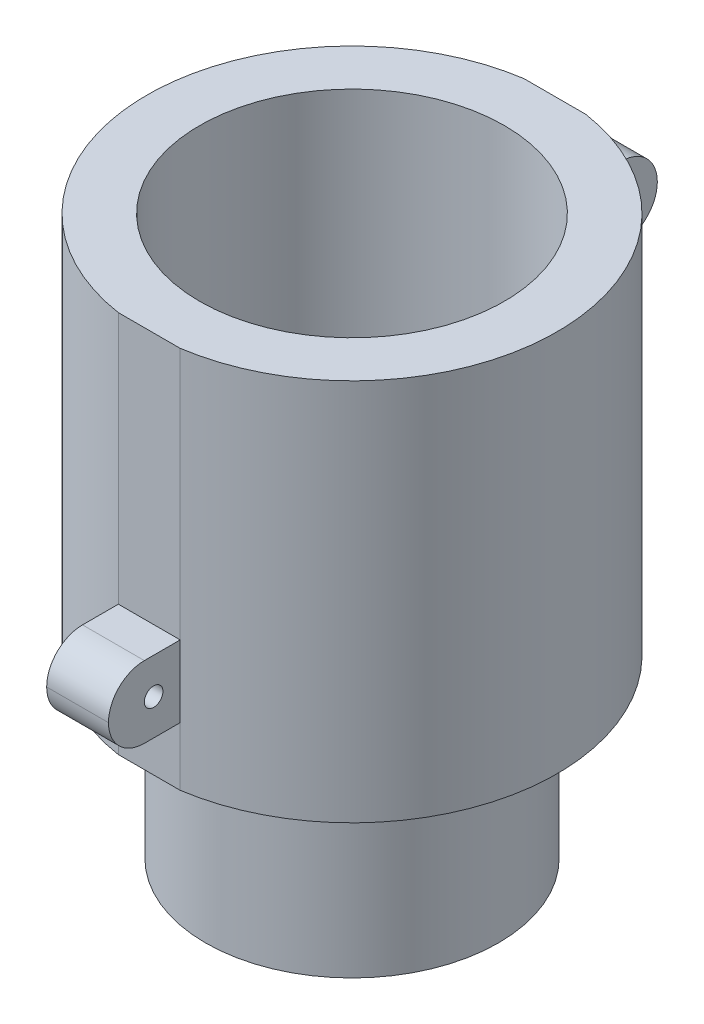
ISO-10303-21;
HEADER;
FILE_DESCRIPTION(('STEP AP214'),'2;1');
FILE_NAME('part.step','',(''),(''),'','','');
FILE_SCHEMA(('AUTOMOTIVE_DESIGN { 1 0 10303 214 1 1 1 1 }'));
ENDSEC;
DATA;
#1=APPLICATION_CONTEXT('core data for automotive mechanical design processes');
#2=APPLICATION_PROTOCOL_DEFINITION('international standard','automotive_design',2000,#1);
#3=PRODUCT_CONTEXT('',#1,'mechanical');
#4=PRODUCT('Part','Part','',(#3));
#5=PRODUCT_RELATED_PRODUCT_CATEGORY('part','',(#4));
#6=PRODUCT_DEFINITION_FORMATION('','',#4);
#7=PRODUCT_DEFINITION_CONTEXT('part definition',#1,'design');
#8=PRODUCT_DEFINITION('design','',#6,#7);
#9=PRODUCT_DEFINITION_SHAPE('','',#8);
#10=(LENGTH_UNIT() NAMED_UNIT(*) SI_UNIT(.MILLI.,.METRE.));
#11=(NAMED_UNIT(*) PLANE_ANGLE_UNIT() SI_UNIT($,.RADIAN.));
#12=(NAMED_UNIT(*) SI_UNIT($,.STERADIAN.) SOLID_ANGLE_UNIT());
#13=UNCERTAINTY_MEASURE_WITH_UNIT(LENGTH_MEASURE(1.E-05),#10,'distance_accuracy_value','');
#14=(GEOMETRIC_REPRESENTATION_CONTEXT(3) GLOBAL_UNCERTAINTY_ASSIGNED_CONTEXT((#13)) GLOBAL_UNIT_ASSIGNED_CONTEXT((#10,
#11,#12)) REPRESENTATION_CONTEXT('',''));
#15=CARTESIAN_POINT('',(0.,0.,0.));
#16=DIRECTION('',(0.,0.,1.));
#17=DIRECTION('',(1.,0.,0.));
#18=AXIS2_PLACEMENT_3D('',#15,#16,#17);
#19=CARTESIAN_POINT('',(-17.5,-2.33500000000001,17.3));
#20=DIRECTION('',(0.,0.,1.));
#21=DIRECTION('',(1.,0.,0.));
#22=AXIS2_PLACEMENT_3D('',#19,#20,#21);
#23=PLANE('',#22);
#24=DIRECTION('',(-1.,0.,0.));
#25=VECTOR('',#24,1.);
#26=CARTESIAN_POINT('',(-2.63818119165462,11.1175,17.3));
#27=LINE('',#26,#25);
#28=CARTESIAN_POINT('',(2.63818119165462,11.1175,17.3));
#29=VERTEX_POINT('',#28);
#30=CARTESIAN_POINT('',(-2.63818119165462,11.1175,17.3));
#31=VERTEX_POINT('',#30);
#32=EDGE_CURVE('E161',#29,#31,#27,.T.);
#33=ORIENTED_EDGE('',*,*,#32,.F.);
#34=DIRECTION('',(0.,-1.,0.));
#35=VECTOR('',#34,1.);
#36=CARTESIAN_POINT('',(2.63818119165462,32.665,17.3));
#37=LINE('',#36,#35);
#38=CARTESIAN_POINT('',(2.63818119165462,32.665,17.3));
#39=VERTEX_POINT('',#38);
#40=EDGE_CURVE('E156',#29,#39,#37,.F.);
#41=ORIENTED_EDGE('',*,*,#40,.T.);
#42=DIRECTION('',(1.,0.,0.));
#43=VECTOR('',#42,1.);
#44=CARTESIAN_POINT('',(-17.5,32.665,17.3));
#45=LINE('',#44,#43);
#46=CARTESIAN_POINT('',(-2.63818119165462,32.665,17.3));
#47=VERTEX_POINT('',#46);
#48=EDGE_CURVE('E208',#47,#39,#45,.T.);
#49=ORIENTED_EDGE('',*,*,#48,.F.);
#50=DIRECTION('',(0.,-1.,0.));
#51=VECTOR('',#50,1.);
#52=CARTESIAN_POINT('',(-2.63818119165462,32.665,17.3));
#53=LINE('',#52,#51);
#54=EDGE_CURVE('E211',#47,#31,#53,.T.);
#55=ORIENTED_EDGE('',*,*,#54,.T.);
#56=EDGE_LOOP('',(#33,#41,#49,#55));
#57=FACE_BOUND('',#56,.T.);
#58=ADVANCED_FACE('F36',(#57),#23,.T.);
#59=CARTESIAN_POINT('',(-17.5,-2.33500000000001,-17.3));
#60=DIRECTION('',(0.,0.,1.));
#61=DIRECTION('',(1.,0.,0.));
#62=AXIS2_PLACEMENT_3D('',#59,#60,#61);
#63=PLANE('',#62);
#64=DIRECTION('',(1.,0.,0.));
#65=VECTOR('',#64,1.);
#66=CARTESIAN_POINT('',(2.63818119165462,27.665,-17.3));
#67=LINE('',#66,#65);
#68=CARTESIAN_POINT('',(-2.63818119165462,27.665,-17.3));
#69=VERTEX_POINT('',#68);
#70=CARTESIAN_POINT('',(2.63818119165462,27.665,-17.3));
#71=VERTEX_POINT('',#70);
#72=EDGE_CURVE('E186',#69,#71,#67,.T.);
#73=ORIENTED_EDGE('',*,*,#72,.F.);
#74=DIRECTION('',(0.,-1.,0.));
#75=VECTOR('',#74,1.);
#76=CARTESIAN_POINT('',(-2.63818119165462,32.665,-17.3));
#77=LINE('',#76,#75);
#78=CARTESIAN_POINT('',(-2.63818119165462,32.665,-17.3));
#79=VERTEX_POINT('',#78);
#80=EDGE_CURVE('E205',#79,#69,#77,.T.);
#81=ORIENTED_EDGE('',*,*,#80,.F.);
#82=DIRECTION('',(1.,0.,0.));
#83=VECTOR('',#82,1.);
#84=CARTESIAN_POINT('',(-17.5,32.665,-17.3));
#85=LINE('',#84,#83);
#86=CARTESIAN_POINT('',(2.63818119165462,32.665,-17.3));
#87=VERTEX_POINT('',#86);
#88=EDGE_CURVE('E197',#79,#87,#85,.T.);
#89=ORIENTED_EDGE('',*,*,#88,.T.);
#90=DIRECTION('',(0.,-1.,0.));
#91=VECTOR('',#90,1.);
#92=CARTESIAN_POINT('',(2.63818119165462,32.665,-17.3));
#93=LINE('',#92,#91);
#94=EDGE_CURVE('E200',#71,#87,#93,.F.);
#95=ORIENTED_EDGE('',*,*,#94,.F.);
#96=EDGE_LOOP('',(#73,#81,#89,#95));
#97=FACE_BOUND('',#96,.T.);
#98=ADVANCED_FACE('F302',(#97),#63,.F.);
#99=DIRECTION('',(-1.,0.,0.));
#100=VECTOR('',#99,1.);
#101=CARTESIAN_POINT('',(2.63818119165462,21.5475,-17.3));
#102=LINE('',#101,#100);
#103=CARTESIAN_POINT('',(2.63818119165462,21.5475,-17.3));
#104=VERTEX_POINT('',#103);
#105=CARTESIAN_POINT('',(-2.63818119165462,21.5475,-17.3));
#106=VERTEX_POINT('',#105);
#107=EDGE_CURVE('E180',#104,#106,#102,.T.);
#108=ORIENTED_EDGE('',*,*,#107,.F.);
#109=CARTESIAN_POINT('',(2.63818119165462,0.,-17.3));
#110=VERTEX_POINT('',#109);
#111=EDGE_CURVE('E201',#110,#104,#93,.F.);
#112=ORIENTED_EDGE('',*,*,#111,.F.);
#113=DIRECTION('',(1.,0.,0.));
#114=VECTOR('',#113,1.);
#115=CARTESIAN_POINT('',(0.,0.,-17.3));
#116=LINE('',#115,#114);
#117=CARTESIAN_POINT('',(-2.63818119165462,0.,-17.3));
#118=VERTEX_POINT('',#117);
#119=EDGE_CURVE('E234',#118,#110,#116,.T.);
#120=ORIENTED_EDGE('',*,*,#119,.F.);
#121=EDGE_CURVE('E204',#106,#118,#77,.T.);
#122=ORIENTED_EDGE('',*,*,#121,.F.);
#123=EDGE_LOOP('',(#108,#112,#120,#122));
#124=FACE_BOUND('',#123,.T.);
#125=ADVANCED_FACE('F307',(#124),#63,.F.);
#126=CARTESIAN_POINT('',(0.,32.665,0.));
#127=DIRECTION('',(0.,-1.,0.));
#128=DIRECTION('',(0.,0.,-1.));
#129=AXIS2_PLACEMENT_3D('',#126,#127,#128);
#130=CYLINDRICAL_SURFACE('',#129,17.5);
#131=CARTESIAN_POINT('',(0.,32.665,0.));
#132=DIRECTION('',(0.,1.,0.));
#133=DIRECTION('',(0.,0.,1.));
#134=AXIS2_PLACEMENT_3D('',#131,#132,#133);
#135=CIRCLE('',#134,17.5);
#136=EDGE_CURVE('E230',#79,#47,#135,.T.);
#137=ORIENTED_EDGE('',*,*,#136,.F.);
#138=ORIENTED_EDGE('',*,*,#80,.T.);
#139=DIRECTION('',(0.,1.,0.));
#140=VECTOR('',#139,1.);
#141=CARTESIAN_POINT('',(-2.63818119165462,27.665,-17.3));
#142=LINE('',#141,#140);
#143=EDGE_CURVE('E183',#106,#69,#142,.T.);
#144=ORIENTED_EDGE('',*,*,#143,.F.);
#145=ORIENTED_EDGE('',*,*,#121,.T.);
#146=CARTESIAN_POINT('',(0.,0.,0.));
#147=DIRECTION('',(0.,1.,0.));
#148=DIRECTION('',(0.,0.,1.));
#149=AXIS2_PLACEMENT_3D('',#146,#147,#148);
#150=CIRCLE('',#149,17.5);
#151=CARTESIAN_POINT('',(-2.63818119165462,0.,17.3));
#152=VERTEX_POINT('',#151);
#153=EDGE_CURVE('E223',#118,#152,#150,.T.);
#154=ORIENTED_EDGE('',*,*,#153,.T.);
#155=CARTESIAN_POINT('',(-2.63818119165462,5.,17.3));
#156=VERTEX_POINT('',#155);
#157=EDGE_CURVE('E155',#156,#152,#53,.T.);
#158=ORIENTED_EDGE('',*,*,#157,.F.);
#159=DIRECTION('',(0.,-1.,0.));
#160=VECTOR('',#159,1.);
#161=CARTESIAN_POINT('',(-2.63818119165462,11.1175,17.3));
#162=LINE('',#161,#160);
#163=EDGE_CURVE('E164',#31,#156,#162,.T.);
#164=ORIENTED_EDGE('',*,*,#163,.F.);
#165=ORIENTED_EDGE('',*,*,#54,.F.);
#166=EDGE_LOOP('',(#137,#138,#144,#145,#154,#158,#164,#165));
#167=FACE_BOUND('',#166,.T.);
#168=ADVANCED_FACE('F282',(#167),#130,.T.);
#169=CARTESIAN_POINT('',(2.63818119165462,0.,17.3));
#170=VERTEX_POINT('',#169);
#171=EDGE_CURVE('E231',#170,#110,#150,.T.);
#172=ORIENTED_EDGE('',*,*,#171,.T.);
#173=ORIENTED_EDGE('',*,*,#111,.T.);
#174=DIRECTION('',(0.,-1.,0.));
#175=VECTOR('',#174,1.);
#176=CARTESIAN_POINT('',(2.63818119165462,27.665,-17.3));
#177=LINE('',#176,#175);
#178=EDGE_CURVE('E177',#71,#104,#177,.T.);
#179=ORIENTED_EDGE('',*,*,#178,.F.);
#180=ORIENTED_EDGE('',*,*,#94,.T.);
#181=EDGE_CURVE('E227',#39,#87,#135,.T.);
#182=ORIENTED_EDGE('',*,*,#181,.F.);
#183=ORIENTED_EDGE('',*,*,#40,.F.);
#184=DIRECTION('',(0.,1.,0.));
#185=VECTOR('',#184,1.);
#186=CARTESIAN_POINT('',(2.63818119165462,11.1175,17.3));
#187=LINE('',#186,#185);
#188=CARTESIAN_POINT('',(2.63818119165462,5.,17.3));
#189=VERTEX_POINT('',#188);
#190=EDGE_CURVE('E138',#189,#29,#187,.T.);
#191=ORIENTED_EDGE('',*,*,#190,.F.);
#192=EDGE_CURVE('E146',#170,#189,#37,.F.);
#193=ORIENTED_EDGE('',*,*,#192,.F.);
#194=EDGE_LOOP('',(#172,#173,#179,#180,#182,#183,#191,#193));
#195=FACE_BOUND('',#194,.T.);
#196=ADVANCED_FACE('F159',(#195),#130,.T.);
#197=CARTESIAN_POINT('',(0.,32.665,0.));
#198=DIRECTION('',(0.,1.,0.));
#199=DIRECTION('',(0.,0.,1.));
#200=AXIS2_PLACEMENT_3D('',#197,#198,#199);
#201=PLANE('',#200);
#202=ORIENTED_EDGE('',*,*,#88,.F.);
#203=ORIENTED_EDGE('',*,*,#136,.T.);
#204=ORIENTED_EDGE('',*,*,#48,.T.);
#205=ORIENTED_EDGE('',*,*,#181,.T.);
#206=EDGE_LOOP('',(#202,#203,#204,#205));
#207=FACE_BOUND('',#206,.T.);
#208=CARTESIAN_POINT('',(0.,32.665,0.));
#209=DIRECTION('',(0.,1.,0.));
#210=DIRECTION('',(0.,0.,1.));
#211=AXIS2_PLACEMENT_3D('',#208,#209,#210);
#212=CIRCLE('',#211,13.);
#213=CARTESIAN_POINT('',(0.,32.665,13.));
#214=VERTEX_POINT('',#213);
#215=EDGE_CURVE('E214',#214,#214,#212,.T.);
#216=ORIENTED_EDGE('',*,*,#215,.F.);
#217=EDGE_LOOP('',(#216));
#218=FACE_BOUND('',#217,.T.);
#219=ADVANCED_FACE('F338',(#207,#218),#201,.T.);
#220=CARTESIAN_POINT('',(0.,0.,0.));
#221=DIRECTION('',(0.,1.,0.));
#222=DIRECTION('',(0.,0.,1.));
#223=AXIS2_PLACEMENT_3D('',#220,#221,#222);
#224=PLANE('',#223);
#225=CARTESIAN_POINT('',(0.,0.,0.));
#226=DIRECTION('',(0.,-1.,0.));
#227=DIRECTION('',(0.,0.,-1.));
#228=AXIS2_PLACEMENT_3D('',#225,#226,#227);
#229=CIRCLE('',#228,12.5);
#230=CARTESIAN_POINT('',(0.,0.,-12.5));
#231=VERTEX_POINT('',#230);
#232=EDGE_CURVE('E224',#231,#231,#229,.T.);
#233=ORIENTED_EDGE('',*,*,#232,.F.);
#234=EDGE_LOOP('',(#233));
#235=FACE_BOUND('',#234,.T.);
#236=ORIENTED_EDGE('',*,*,#153,.F.);
#237=ORIENTED_EDGE('',*,*,#119,.T.);
#238=ORIENTED_EDGE('',*,*,#171,.F.);
#239=DIRECTION('',(1.,0.,0.));
#240=VECTOR('',#239,1.);
#241=CARTESIAN_POINT('',(0.,0.,17.3));
#242=LINE('',#241,#240);
#243=EDGE_CURVE('E151',#152,#170,#242,.T.);
#244=ORIENTED_EDGE('',*,*,#243,.F.);
#245=EDGE_LOOP('',(#236,#237,#238,#244));
#246=FACE_BOUND('',#245,.T.);
#247=ADVANCED_FACE('F336',(#235,#246),#224,.F.);
#248=CARTESIAN_POINT('',(0.,-15.,0.));
#249=DIRECTION('',(0.,1.,0.));
#250=DIRECTION('',(0.,0.,1.));
#251=AXIS2_PLACEMENT_3D('',#248,#249,#250);
#252=CYLINDRICAL_SURFACE('',#251,12.5);
#253=CARTESIAN_POINT('',(0.,-15.,0.));
#254=DIRECTION('',(0.,-1.,0.));
#255=DIRECTION('',(0.,0.,-1.));
#256=AXIS2_PLACEMENT_3D('',#253,#254,#255);
#257=CIRCLE('',#256,12.5);
#258=CARTESIAN_POINT('',(0.,-15.,-12.5));
#259=VERTEX_POINT('',#258);
#260=EDGE_CURVE('E218',#259,#259,#257,.T.);
#261=ORIENTED_EDGE('',*,*,#260,.F.);
#262=EDGE_LOOP('',(#261));
#263=FACE_BOUND('',#262,.T.);
#264=ORIENTED_EDGE('',*,*,#232,.T.);
#265=EDGE_LOOP('',(#264));
#266=FACE_BOUND('',#265,.T.);
#267=ADVANCED_FACE('F332',(#263,#266),#252,.T.);
#268=CARTESIAN_POINT('',(0.,-15.,0.));
#269=DIRECTION('',(0.,-1.,0.));
#270=DIRECTION('',(0.,0.,-1.));
#271=AXIS2_PLACEMENT_3D('',#268,#269,#270);
#272=PLANE('',#271);
#273=ORIENTED_EDGE('',*,*,#260,.T.);
#274=EDGE_LOOP('',(#273));
#275=FACE_BOUND('',#274,.T.);
#276=ADVANCED_FACE('F326',(#275),#272,.T.);
#277=CARTESIAN_POINT('',(0.,7.665,0.));
#278=DIRECTION('',(0.,1.,0.));
#279=DIRECTION('',(0.,0.,1.));
#280=AXIS2_PLACEMENT_3D('',#277,#278,#279);
#281=CYLINDRICAL_SURFACE('',#280,13.);
#282=CARTESIAN_POINT('',(0.,7.665,0.));
#283=DIRECTION('',(0.,1.,0.));
#284=DIRECTION('',(0.,0.,1.));
#285=AXIS2_PLACEMENT_3D('',#282,#283,#284);
#286=CIRCLE('',#285,13.);
#287=CARTESIAN_POINT('',(0.,7.665,13.));
#288=VERTEX_POINT('',#287);
#289=EDGE_CURVE('E215',#288,#288,#286,.T.);
#290=ORIENTED_EDGE('',*,*,#289,.F.);
#291=EDGE_LOOP('',(#290));
#292=FACE_BOUND('',#291,.T.);
#293=ORIENTED_EDGE('',*,*,#215,.T.);
#294=EDGE_LOOP('',(#293));
#295=FACE_BOUND('',#294,.T.);
#296=ADVANCED_FACE('F321',(#292,#295),#281,.F.);
#297=CARTESIAN_POINT('',(0.,7.665,0.));
#298=DIRECTION('',(0.,1.,0.));
#299=DIRECTION('',(0.,0.,1.));
#300=AXIS2_PLACEMENT_3D('',#297,#298,#299);
#301=PLANE('',#300);
#302=ORIENTED_EDGE('',*,*,#289,.T.);
#303=EDGE_LOOP('',(#302));
#304=FACE_BOUND('',#303,.T.);
#305=ADVANCED_FACE('F313',(#304),#301,.T.);
#306=DIRECTION('',(1.,0.,0.));
#307=VECTOR('',#306,1.);
#308=CARTESIAN_POINT('',(-2.63818119165462,5.,17.3));
#309=LINE('',#308,#307);
#310=EDGE_CURVE('E148',#156,#189,#309,.T.);
#311=ORIENTED_EDGE('',*,*,#310,.F.);
#312=ORIENTED_EDGE('',*,*,#157,.T.);
#313=ORIENTED_EDGE('',*,*,#243,.T.);
#314=ORIENTED_EDGE('',*,*,#192,.T.);
#315=EDGE_LOOP('',(#311,#312,#313,#314));
#316=FACE_BOUND('',#315,.T.);
#317=ADVANCED_FACE('F147',(#316),#23,.T.);
#318=CARTESIAN_POINT('',(2.63818119165462,27.665,-23.4175));
#319=DIRECTION('',(-1.,0.,0.));
#320=DIRECTION('',(0.,-1.,0.));
#321=AXIS2_PLACEMENT_3D('',#318,#319,#320);
#322=PLANE('',#321);
#323=CARTESIAN_POINT('',(2.63818119165462,24.60625,-19.565));
#324=DIRECTION('',(1.,0.,0.));
#325=DIRECTION('',(0.,1.,0.));
#326=AXIS2_PLACEMENT_3D('',#323,#324,#325);
#327=CIRCLE('',#326,0.793749999999999);
#328=CARTESIAN_POINT('',(2.63818119165462,25.4,-19.565));
#329=VERTEX_POINT('',#328);
#330=EDGE_CURVE('E242',#329,#329,#327,.T.);
#331=ORIENTED_EDGE('',*,*,#330,.F.);
#332=EDGE_LOOP('',(#331));
#333=FACE_BOUND('',#332,.T.);
#334=DIRECTION('',(0.,0.,1.));
#335=VECTOR('',#334,1.);
#336=CARTESIAN_POINT('',(2.63818119165462,21.5475,-23.4175));
#337=LINE('',#336,#335);
#338=CARTESIAN_POINT('',(2.63818119165462,21.5475,-20.357501021242));
#339=VERTEX_POINT('',#338);
#340=EDGE_CURVE('E195',#339,#104,#337,.T.);
#341=ORIENTED_EDGE('',*,*,#340,.F.);
#342=CARTESIAN_POINT('',(2.63818119165462,24.6075,-20.357501021242));
#343=DIRECTION('',(-1.,0.,0.));
#344=DIRECTION('',(0.,-1.,0.));
#345=AXIS2_PLACEMENT_3D('',#342,#343,#344);
#346=CIRCLE('',#345,3.06);
#347=CARTESIAN_POINT('',(2.63818119165462,24.605,-23.4175));
#348=VERTEX_POINT('',#347);
#349=EDGE_CURVE('E256',#339,#348,#346,.F.);
#350=ORIENTED_EDGE('',*,*,#349,.T.);
#351=CARTESIAN_POINT('',(2.63818119165462,24.605,-20.3575));
#352=DIRECTION('',(-1.,0.,0.));
#353=DIRECTION('',(0.,-1.,0.));
#354=AXIS2_PLACEMENT_3D('',#351,#352,#353);
#355=CIRCLE('',#354,3.06);
#356=CARTESIAN_POINT('',(2.63818119165462,27.665,-20.3575));
#357=VERTEX_POINT('',#356);
#358=EDGE_CURVE('E245',#348,#357,#355,.F.);
#359=ORIENTED_EDGE('',*,*,#358,.T.);
#360=DIRECTION('',(0.,0.,1.));
#361=VECTOR('',#360,1.);
#362=CARTESIAN_POINT('',(2.63818119165462,27.665,-23.4175));
#363=LINE('',#362,#361);
#364=EDGE_CURVE('E189',#357,#71,#363,.T.);
#365=ORIENTED_EDGE('',*,*,#364,.T.);
#366=ORIENTED_EDGE('',*,*,#178,.T.);
#367=EDGE_LOOP('',(#341,#350,#359,#365,#366));
#368=FACE_BOUND('',#367,.T.);
#369=ADVANCED_FACE('F312',(#333,#368),#322,.F.);
#370=CARTESIAN_POINT('',(2.63818119165462,21.5475,-23.4175));
#371=DIRECTION('',(0.,1.,0.));
#372=DIRECTION('',(0.,0.,1.));
#373=AXIS2_PLACEMENT_3D('',#370,#371,#372);
#374=PLANE('',#373);
#375=DIRECTION('',(0.,0.,1.));
#376=VECTOR('',#375,1.);
#377=CARTESIAN_POINT('',(-2.63818119165462,21.5475,-23.4175));
#378=LINE('',#377,#376);
#379=CARTESIAN_POINT('',(-2.63818119165462,21.5475,-20.357501021242));
#380=VERTEX_POINT('',#379);
#381=EDGE_CURVE('E193',#380,#106,#378,.T.);
#382=ORIENTED_EDGE('',*,*,#381,.F.);
#383=DIRECTION('',(1.,0.,0.));
#384=VECTOR('',#383,1.);
#385=CARTESIAN_POINT('',(2.63818119165462,21.5475,-20.357501021242));
#386=LINE('',#385,#384);
#387=EDGE_CURVE('E254',#380,#339,#386,.T.);
#388=ORIENTED_EDGE('',*,*,#387,.T.);
#389=ORIENTED_EDGE('',*,*,#340,.T.);
#390=ORIENTED_EDGE('',*,*,#107,.T.);
#391=EDGE_LOOP('',(#382,#388,#389,#390));
#392=FACE_BOUND('',#391,.T.);
#393=ADVANCED_FACE('F318',(#392),#374,.F.);
#394=CARTESIAN_POINT('',(-2.63818119165462,27.665,-23.4175));
#395=DIRECTION('',(1.,0.,0.));
#396=DIRECTION('',(0.,1.,0.));
#397=AXIS2_PLACEMENT_3D('',#394,#395,#396);
#398=PLANE('',#397);
#399=CARTESIAN_POINT('',(-2.63818119165462,24.60625,-19.565));
#400=DIRECTION('',(1.,0.,0.));
#401=DIRECTION('',(0.,1.,0.));
#402=AXIS2_PLACEMENT_3D('',#399,#400,#401);
#403=CIRCLE('',#402,0.793749999999999);
#404=CARTESIAN_POINT('',(-2.63818119165462,25.4,-19.565));
#405=VERTEX_POINT('',#404);
#406=EDGE_CURVE('E238',#405,#405,#403,.T.);
#407=ORIENTED_EDGE('',*,*,#406,.T.);
#408=EDGE_LOOP('',(#407));
#409=FACE_BOUND('',#408,.T.);
#410=CARTESIAN_POINT('',(-2.63818119165462,24.605,-20.3575));
#411=DIRECTION('',(1.,0.,0.));
#412=DIRECTION('',(0.,1.,0.));
#413=AXIS2_PLACEMENT_3D('',#410,#411,#412);
#414=CIRCLE('',#413,3.06);
#415=CARTESIAN_POINT('',(-2.63818119165462,27.665,-20.3575));
#416=VERTEX_POINT('',#415);
#417=CARTESIAN_POINT('',(-2.63818119165462,24.605,-23.4175));
#418=VERTEX_POINT('',#417);
#419=EDGE_CURVE('E249',#416,#418,#414,.F.);
#420=ORIENTED_EDGE('',*,*,#419,.T.);
#421=CARTESIAN_POINT('',(-2.63818119165462,24.6075,-20.357501021242));
#422=DIRECTION('',(1.,0.,0.));
#423=DIRECTION('',(0.,1.,0.));
#424=AXIS2_PLACEMENT_3D('',#421,#422,#423);
#425=CIRCLE('',#424,3.06);
#426=EDGE_CURVE('E252',#418,#380,#425,.F.);
#427=ORIENTED_EDGE('',*,*,#426,.T.);
#428=ORIENTED_EDGE('',*,*,#381,.T.);
#429=ORIENTED_EDGE('',*,*,#143,.T.);
#430=DIRECTION('',(0.,0.,1.));
#431=VECTOR('',#430,1.);
#432=CARTESIAN_POINT('',(-2.63818119165462,27.665,-23.4175));
#433=LINE('',#432,#431);
#434=EDGE_CURVE('E191',#416,#69,#433,.T.);
#435=ORIENTED_EDGE('',*,*,#434,.F.);
#436=EDGE_LOOP('',(#420,#427,#428,#429,#435));
#437=FACE_BOUND('',#436,.T.);
#438=ADVANCED_FACE('F414',(#409,#437),#398,.F.);
#439=CARTESIAN_POINT('',(2.63818119165462,27.665,-23.4175));
#440=DIRECTION('',(0.,-1.,0.));
#441=DIRECTION('',(0.,0.,-1.));
#442=AXIS2_PLACEMENT_3D('',#439,#440,#441);
#443=PLANE('',#442);
#444=ORIENTED_EDGE('',*,*,#364,.F.);
#445=DIRECTION('',(1.,0.,0.));
#446=VECTOR('',#445,1.);
#447=CARTESIAN_POINT('',(-2.63818119165462,27.665,-20.3575));
#448=LINE('',#447,#446);
#449=EDGE_CURVE('E247',#357,#416,#448,.F.);
#450=ORIENTED_EDGE('',*,*,#449,.T.);
#451=ORIENTED_EDGE('',*,*,#434,.T.);
#452=ORIENTED_EDGE('',*,*,#72,.T.);
#453=EDGE_LOOP('',(#444,#450,#451,#452));
#454=FACE_BOUND('',#453,.T.);
#455=ADVANCED_FACE('F388',(#454),#443,.F.);
#456=CARTESIAN_POINT('',(-2.63818119165462,11.1175,23.4175));
#457=DIRECTION('',(1.,0.,0.));
#458=DIRECTION('',(0.,1.,0.));
#459=AXIS2_PLACEMENT_3D('',#456,#457,#458);
#460=PLANE('',#459);
#461=CARTESIAN_POINT('',(-2.63818119165462,8.0575,19.565));
#462=DIRECTION('',(1.,0.,0.));
#463=DIRECTION('',(0.,1.,0.));
#464=AXIS2_PLACEMENT_3D('',#461,#462,#463);
#465=CIRCLE('',#464,0.793749999999999);
#466=CARTESIAN_POINT('',(-2.63818119165462,8.85125,19.565));
#467=VERTEX_POINT('',#466);
#468=EDGE_CURVE('E167',#467,#467,#465,.T.);
#469=ORIENTED_EDGE('',*,*,#468,.T.);
#470=EDGE_LOOP('',(#469));
#471=FACE_BOUND('',#470,.T.);
#472=DIRECTION('',(0.,0.,-1.));
#473=VECTOR('',#472,1.);
#474=CARTESIAN_POINT('',(-2.63818119165462,5.,23.4175));
#475=LINE('',#474,#473);
#476=CARTESIAN_POINT('',(-2.63818119165462,5.,20.357501021242));
#477=VERTEX_POINT('',#476);
#478=EDGE_CURVE('E140',#477,#156,#475,.T.);
#479=ORIENTED_EDGE('',*,*,#478,.F.);
#480=CARTESIAN_POINT('',(-2.63818119165462,8.06,20.357501021242));
#481=DIRECTION('',(1.,0.,0.));
#482=DIRECTION('',(0.,1.,0.));
#483=AXIS2_PLACEMENT_3D('',#480,#481,#482);
#484=CIRCLE('',#483,3.06);
#485=CARTESIAN_POINT('',(-2.63818119165462,8.0575,23.4175));
#486=VERTEX_POINT('',#485);
#487=EDGE_CURVE('E11',#477,#486,#484,.F.);
#488=ORIENTED_EDGE('',*,*,#487,.T.);
#489=CARTESIAN_POINT('',(-2.63818119165462,8.0575,20.3575));
#490=DIRECTION('',(1.,0.,0.));
#491=DIRECTION('',(0.,1.,0.));
#492=AXIS2_PLACEMENT_3D('',#489,#490,#491);
#493=CIRCLE('',#492,3.06);
#494=CARTESIAN_POINT('',(-2.63818119165462,11.1175,20.3575));
#495=VERTEX_POINT('',#494);
#496=EDGE_CURVE('E261',#486,#495,#493,.F.);
#497=ORIENTED_EDGE('',*,*,#496,.T.);
#498=DIRECTION('',(0.,0.,-1.));
#499=VECTOR('',#498,1.);
#500=CARTESIAN_POINT('',(-2.63818119165462,11.1175,23.4175));
#501=LINE('',#500,#499);
#502=EDGE_CURVE('E173',#495,#31,#501,.T.);
#503=ORIENTED_EDGE('',*,*,#502,.T.);
#504=ORIENTED_EDGE('',*,*,#163,.T.);
#505=EDGE_LOOP('',(#479,#488,#497,#503,#504));
#506=FACE_BOUND('',#505,.T.);
#507=ADVANCED_FACE('F276',(#471,#506),#460,.F.);
#508=CARTESIAN_POINT('',(-2.63818119165462,5.,23.4175));
#509=DIRECTION('',(0.,1.,0.));
#510=DIRECTION('',(-1.,0.,0.));
#511=AXIS2_PLACEMENT_3D('',#508,#509,#510);
#512=PLANE('',#511);
#513=DIRECTION('',(0.,0.,-1.));
#514=VECTOR('',#513,1.);
#515=CARTESIAN_POINT('',(2.63818119165462,5.,23.4175));
#516=LINE('',#515,#514);
#517=CARTESIAN_POINT('',(2.63818119165462,5.,20.357501021242));
#518=VERTEX_POINT('',#517);
#519=EDGE_CURVE('E133',#518,#189,#516,.T.);
#520=ORIENTED_EDGE('',*,*,#519,.F.);
#521=DIRECTION('',(-1.,0.,0.));
#522=VECTOR('',#521,1.);
#523=CARTESIAN_POINT('',(-2.63818119165462,5.,20.357501021242));
#524=LINE('',#523,#522);
#525=EDGE_CURVE('E44',#518,#477,#524,.T.);
#526=ORIENTED_EDGE('',*,*,#525,.T.);
#527=ORIENTED_EDGE('',*,*,#478,.T.);
#528=ORIENTED_EDGE('',*,*,#310,.T.);
#529=EDGE_LOOP('',(#520,#526,#527,#528));
#530=FACE_BOUND('',#529,.T.);
#531=ADVANCED_FACE('F163',(#530),#512,.F.);
#532=CARTESIAN_POINT('',(2.63818119165462,11.1175,23.4175));
#533=DIRECTION('',(-1.,0.,0.));
#534=DIRECTION('',(0.,0.,1.));
#535=AXIS2_PLACEMENT_3D('',#532,#533,#534);
#536=PLANE('',#535);
#537=CARTESIAN_POINT('',(2.63818119165462,8.0575,19.565));
#538=DIRECTION('',(1.,0.,0.));
#539=DIRECTION('',(0.,0.,-1.));
#540=AXIS2_PLACEMENT_3D('',#537,#538,#539);
#541=CIRCLE('',#540,0.793749999999999);
#542=CARTESIAN_POINT('',(2.63818119165462,8.0575,18.77125));
#543=VERTEX_POINT('',#542);
#544=EDGE_CURVE('E241',#543,#543,#541,.T.);
#545=ORIENTED_EDGE('',*,*,#544,.F.);
#546=EDGE_LOOP('',(#545));
#547=FACE_BOUND('',#546,.T.);
#548=CARTESIAN_POINT('',(2.63818119165462,8.0575,20.3575));
#549=DIRECTION('',(-1.,0.,0.));
#550=DIRECTION('',(0.,0.,1.));
#551=AXIS2_PLACEMENT_3D('',#548,#549,#550);
#552=CIRCLE('',#551,3.06);
#553=CARTESIAN_POINT('',(2.63818119165462,11.1175,20.3575));
#554=VERTEX_POINT('',#553);
#555=CARTESIAN_POINT('',(2.63818119165462,8.0575,23.4175));
#556=VERTEX_POINT('',#555);
#557=EDGE_CURVE('E265',#554,#556,#552,.F.);
#558=ORIENTED_EDGE('',*,*,#557,.T.);
#559=CARTESIAN_POINT('',(2.63818119165462,8.06,20.357501021242));
#560=DIRECTION('',(-1.,0.,0.));
#561=DIRECTION('',(0.,0.,1.));
#562=AXIS2_PLACEMENT_3D('',#559,#560,#561);
#563=CIRCLE('',#562,3.06);
#564=EDGE_CURVE('E58',#556,#518,#563,.F.);
#565=ORIENTED_EDGE('',*,*,#564,.T.);
#566=ORIENTED_EDGE('',*,*,#519,.T.);
#567=ORIENTED_EDGE('',*,*,#190,.T.);
#568=DIRECTION('',(0.,0.,-1.));
#569=VECTOR('',#568,1.);
#570=CARTESIAN_POINT('',(2.63818119165462,11.1175,23.4175));
#571=LINE('',#570,#569);
#572=EDGE_CURVE('E141',#554,#29,#571,.T.);
#573=ORIENTED_EDGE('',*,*,#572,.F.);
#574=EDGE_LOOP('',(#558,#565,#566,#567,#573));
#575=FACE_BOUND('',#574,.T.);
#576=ADVANCED_FACE('F135',(#547,#575),#536,.F.);
#577=CARTESIAN_POINT('',(-2.63818119165462,11.1175,23.4175));
#578=DIRECTION('',(0.,-1.,0.));
#579=DIRECTION('',(0.,0.,-1.));
#580=AXIS2_PLACEMENT_3D('',#577,#578,#579);
#581=PLANE('',#580);
#582=ORIENTED_EDGE('',*,*,#502,.F.);
#583=DIRECTION('',(-1.,0.,0.));
#584=VECTOR('',#583,1.);
#585=CARTESIAN_POINT('',(2.63818119165462,11.1175,20.3575));
#586=LINE('',#585,#584);
#587=EDGE_CURVE('E263',#495,#554,#586,.F.);
#588=ORIENTED_EDGE('',*,*,#587,.T.);
#589=ORIENTED_EDGE('',*,*,#572,.T.);
#590=ORIENTED_EDGE('',*,*,#32,.T.);
#591=EDGE_LOOP('',(#582,#588,#589,#590));
#592=FACE_BOUND('',#591,.T.);
#593=ADVANCED_FACE('F288',(#592),#581,.F.);
#594=CARTESIAN_POINT('',(-3.47931880834538,8.0575,19.565));
#595=DIRECTION('',(1.,0.,0.));
#596=DIRECTION('',(0.,0.,-1.));
#597=AXIS2_PLACEMENT_3D('',#594,#595,#596);
#598=CYLINDRICAL_SURFACE('',#597,0.793749999999999);
#599=ORIENTED_EDGE('',*,*,#544,.T.);
#600=EDGE_LOOP('',(#599));
#601=FACE_BOUND('',#600,.T.);
#602=ORIENTED_EDGE('',*,*,#468,.F.);
#603=EDGE_LOOP('',(#602));
#604=FACE_BOUND('',#603,.T.);
#605=ADVANCED_FACE('F290',(#601,#604),#598,.F.);
#606=CARTESIAN_POINT('',(-3.47931880834538,24.60625,-19.565));
#607=DIRECTION('',(1.,0.,0.));
#608=DIRECTION('',(0.,1.,0.));
#609=AXIS2_PLACEMENT_3D('',#606,#607,#608);
#610=CYLINDRICAL_SURFACE('',#609,0.793749999999999);
#611=ORIENTED_EDGE('',*,*,#330,.T.);
#612=EDGE_LOOP('',(#611));
#613=FACE_BOUND('',#612,.T.);
#614=ORIENTED_EDGE('',*,*,#406,.F.);
#615=EDGE_LOOP('',(#614));
#616=FACE_BOUND('',#615,.T.);
#617=ADVANCED_FACE('F296',(#613,#616),#610,.F.);
#618=CARTESIAN_POINT('',(0.,24.605,-20.3575));
#619=DIRECTION('',(-1.,0.,0.));
#620=DIRECTION('',(0.,0.,1.));
#621=AXIS2_PLACEMENT_3D('',#618,#619,#620);
#622=CYLINDRICAL_SURFACE('',#621,3.06);
#623=ORIENTED_EDGE('',*,*,#419,.F.);
#624=ORIENTED_EDGE('',*,*,#449,.F.);
#625=ORIENTED_EDGE('',*,*,#358,.F.);
#626=DIRECTION('',(1.,0.,0.));
#627=VECTOR('',#626,1.);
#628=CARTESIAN_POINT('',(2.63818119165462,24.605,-23.4175));
#629=LINE('',#628,#627);
#630=EDGE_CURVE('E237',#418,#348,#629,.T.);
#631=ORIENTED_EDGE('',*,*,#630,.F.);
#632=EDGE_LOOP('',(#623,#624,#625,#631));
#633=FACE_BOUND('',#632,.T.);
#634=ADVANCED_FACE('F347',(#633),#622,.T.);
#635=CARTESIAN_POINT('',(0.,24.6075,-20.357501021242));
#636=DIRECTION('',(1.,0.,0.));
#637=DIRECTION('',(0.,0.,-1.));
#638=AXIS2_PLACEMENT_3D('',#635,#636,#637);
#639=CYLINDRICAL_SURFACE('',#638,3.06);
#640=ORIENTED_EDGE('',*,*,#349,.F.);
#641=ORIENTED_EDGE('',*,*,#387,.F.);
#642=ORIENTED_EDGE('',*,*,#426,.F.);
#643=ORIENTED_EDGE('',*,*,#630,.T.);
#644=EDGE_LOOP('',(#640,#641,#642,#643));
#645=FACE_BOUND('',#644,.T.);
#646=ADVANCED_FACE('F350',(#645),#639,.T.);
#647=CARTESIAN_POINT('',(0.,8.0575,20.3575));
#648=DIRECTION('',(1.,0.,0.));
#649=DIRECTION('',(0.,0.,-1.));
#650=AXIS2_PLACEMENT_3D('',#647,#648,#649);
#651=CYLINDRICAL_SURFACE('',#650,3.06);
#652=ORIENTED_EDGE('',*,*,#557,.F.);
#653=ORIENTED_EDGE('',*,*,#587,.F.);
#654=ORIENTED_EDGE('',*,*,#496,.F.);
#655=DIRECTION('',(-1.,0.,0.));
#656=VECTOR('',#655,1.);
#657=CARTESIAN_POINT('',(-2.63818119165462,8.0575,23.4175));
#658=LINE('',#657,#656);
#659=EDGE_CURVE('E258',#556,#486,#658,.T.);
#660=ORIENTED_EDGE('',*,*,#659,.F.);
#661=EDGE_LOOP('',(#652,#653,#654,#660));
#662=FACE_BOUND('',#661,.T.);
#663=ADVANCED_FACE('F272',(#662),#651,.T.);
#664=CARTESIAN_POINT('',(0.,8.06,20.357501021242));
#665=DIRECTION('',(-1.,0.,0.));
#666=DIRECTION('',(0.,0.,1.));
#667=AXIS2_PLACEMENT_3D('',#664,#665,#666);
#668=CYLINDRICAL_SURFACE('',#667,3.06);
#669=ORIENTED_EDGE('',*,*,#487,.F.);
#670=ORIENTED_EDGE('',*,*,#525,.F.);
#671=ORIENTED_EDGE('',*,*,#564,.F.);
#672=ORIENTED_EDGE('',*,*,#659,.T.);
#673=EDGE_LOOP('',(#669,#670,#671,#672));
#674=FACE_BOUND('',#673,.T.);
#675=ADVANCED_FACE('F38',(#674),#668,.T.);
#676=CLOSED_SHELL('',(#58,#98,#125,#168,#196,#219,#247,#267,#276,#296,#305,#317,#369,#393,#438,
#455,#507,#531,#576,#593,#605,#617,#634,#646,#663,#675));
#677=MANIFOLD_SOLID_BREP('B2',#676);
#678=ADVANCED_BREP_SHAPE_REPRESENTATION('',(#18,#677),#14);
#679=SHAPE_DEFINITION_REPRESENTATION(#9,#678);
ENDSEC;
END-ISO-10303-21;
